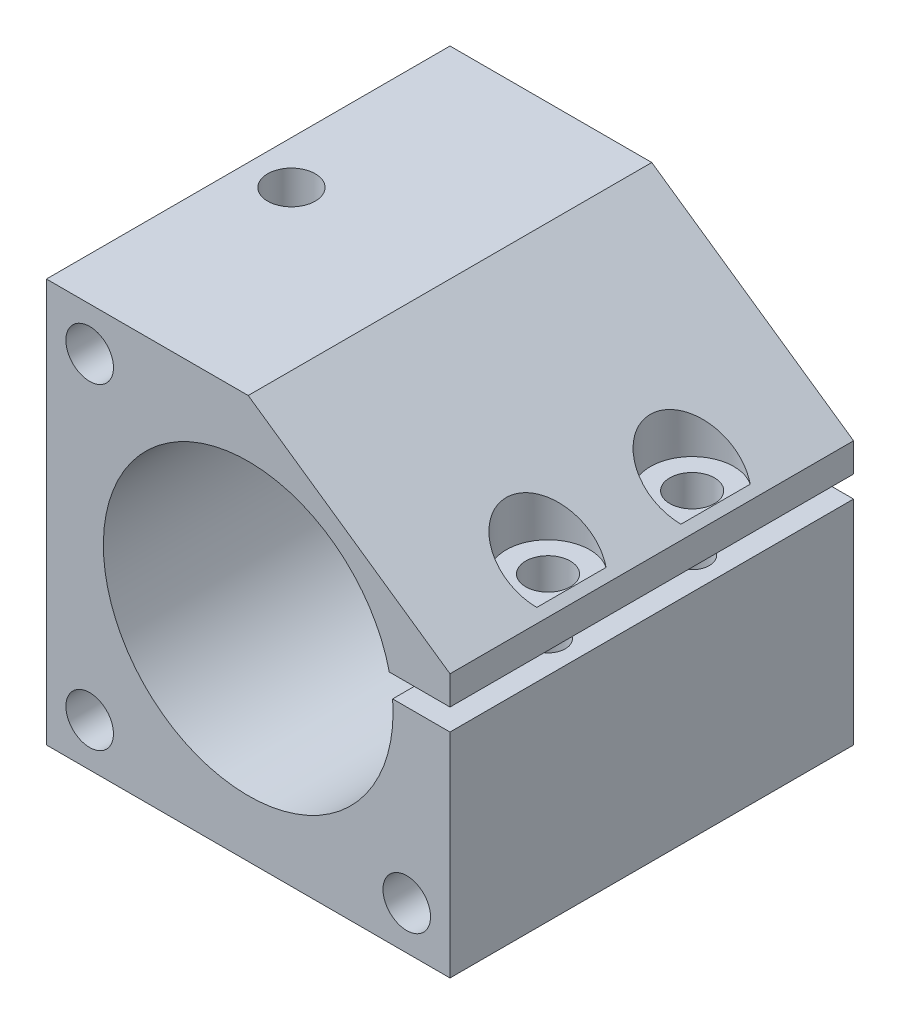
ISO-10303-21;
HEADER;
FILE_DESCRIPTION(('STEP AP214'),'2;1');
FILE_NAME('part.step','',(''),(''),'','','');
FILE_SCHEMA(('AUTOMOTIVE_DESIGN { 1 0 10303 214 1 1 1 1 }'));
ENDSEC;
DATA;
#1=APPLICATION_CONTEXT('core data for automotive mechanical design processes');
#2=APPLICATION_PROTOCOL_DEFINITION('international standard','automotive_design',2000,#1);
#3=PRODUCT_CONTEXT('',#1,'mechanical');
#4=PRODUCT('Part','Part','',(#3));
#5=PRODUCT_RELATED_PRODUCT_CATEGORY('part','',(#4));
#6=PRODUCT_DEFINITION_FORMATION('','',#4);
#7=PRODUCT_DEFINITION_CONTEXT('part definition',#1,'design');
#8=PRODUCT_DEFINITION('design','',#6,#7);
#9=PRODUCT_DEFINITION_SHAPE('','',#8);
#10=(LENGTH_UNIT() NAMED_UNIT(*) SI_UNIT(.MILLI.,.METRE.));
#11=(NAMED_UNIT(*) PLANE_ANGLE_UNIT() SI_UNIT($,.RADIAN.));
#12=(NAMED_UNIT(*) SI_UNIT($,.STERADIAN.) SOLID_ANGLE_UNIT());
#13=UNCERTAINTY_MEASURE_WITH_UNIT(LENGTH_MEASURE(1.E-05),#10,'distance_accuracy_value','');
#14=(GEOMETRIC_REPRESENTATION_CONTEXT(3) GLOBAL_UNCERTAINTY_ASSIGNED_CONTEXT((#13)) GLOBAL_UNIT_ASSIGNED_CONTEXT((#10,
#11,#12)) REPRESENTATION_CONTEXT('',''));
#15=CARTESIAN_POINT('',(0.,0.,0.));
#16=DIRECTION('',(0.,0.,1.));
#17=DIRECTION('',(1.,0.,0.));
#18=AXIS2_PLACEMENT_3D('',#15,#16,#17);
#19=CARTESIAN_POINT('',(11.,-11.,28.));
#20=DIRECTION('',(0.,0.,-1.));
#21=DIRECTION('',(-1.,0.,0.));
#22=AXIS2_PLACEMENT_3D('',#19,#20,#21);
#23=CYLINDRICAL_SURFACE('',#22,1.65);
#24=CARTESIAN_POINT('',(11.,-11.,0.));
#25=DIRECTION('',(0.,0.,1.));
#26=DIRECTION('',(1.,0.,0.));
#27=AXIS2_PLACEMENT_3D('',#24,#25,#26);
#28=CIRCLE('',#27,1.65);
#29=CARTESIAN_POINT('',(12.65,-11.,0.));
#30=VERTEX_POINT('',#29);
#31=EDGE_CURVE('E174',#30,#30,#28,.T.);
#32=ORIENTED_EDGE('',*,*,#31,.F.);
#33=EDGE_LOOP('',(#32));
#34=FACE_BOUND('',#33,.T.);
#35=CARTESIAN_POINT('',(11.,-11.,11.));
#36=DIRECTION('',(0.,0.,1.));
#37=DIRECTION('',(1.,0.,0.));
#38=AXIS2_PLACEMENT_3D('',#35,#36,#37);
#39=CIRCLE('',#38,1.65);
#40=CARTESIAN_POINT('',(12.65,-11.,11.));
#41=VERTEX_POINT('',#40);
#42=EDGE_CURVE('E343',#41,#41,#39,.T.);
#43=ORIENTED_EDGE('',*,*,#42,.T.);
#44=EDGE_LOOP('',(#43));
#45=FACE_BOUND('',#44,.T.);
#46=ADVANCED_FACE('F35',(#34,#45),#23,.F.);
#47=CARTESIAN_POINT('',(-11.,-11.,28.));
#48=DIRECTION('',(0.,0.,-1.));
#49=DIRECTION('',(-1.,0.,0.));
#50=AXIS2_PLACEMENT_3D('',#47,#48,#49);
#51=CYLINDRICAL_SURFACE('',#50,1.65000000000001);
#52=CARTESIAN_POINT('',(-11.,-11.,0.));
#53=DIRECTION('',(0.,0.,1.));
#54=DIRECTION('',(-1.,0.,0.));
#55=AXIS2_PLACEMENT_3D('',#52,#53,#54);
#56=CIRCLE('',#55,1.65000000000001);
#57=CARTESIAN_POINT('',(-12.65,-11.,0.));
#58=VERTEX_POINT('',#57);
#59=EDGE_CURVE('E165',#58,#58,#56,.T.);
#60=ORIENTED_EDGE('',*,*,#59,.F.);
#61=EDGE_LOOP('',(#60));
#62=FACE_BOUND('',#61,.T.);
#63=CARTESIAN_POINT('',(-11.,-11.,11.));
#64=DIRECTION('',(0.,0.,1.));
#65=DIRECTION('',(1.,0.,0.));
#66=AXIS2_PLACEMENT_3D('',#63,#64,#65);
#67=CIRCLE('',#66,1.65000000000001);
#68=CARTESIAN_POINT('',(-9.34999999999999,-11.,11.));
#69=VERTEX_POINT('',#68);
#70=EDGE_CURVE('E340',#69,#69,#67,.T.);
#71=ORIENTED_EDGE('',*,*,#70,.T.);
#72=EDGE_LOOP('',(#71));
#73=FACE_BOUND('',#72,.T.);
#74=ADVANCED_FACE('F159',(#62,#73),#51,.F.);
#75=CARTESIAN_POINT('',(-11.,11.,28.));
#76=DIRECTION('',(0.,0.,-1.));
#77=DIRECTION('',(-1.,0.,0.));
#78=AXIS2_PLACEMENT_3D('',#75,#76,#77);
#79=CYLINDRICAL_SURFACE('',#78,1.65000000000001);
#80=CARTESIAN_POINT('',(-11.,11.,0.));
#81=DIRECTION('',(0.,0.,1.));
#82=DIRECTION('',(1.,0.,0.));
#83=AXIS2_PLACEMENT_3D('',#80,#81,#82);
#84=CIRCLE('',#83,1.65000000000001);
#85=CARTESIAN_POINT('',(-9.34999999999999,11.,0.));
#86=VERTEX_POINT('',#85);
#87=EDGE_CURVE('E164',#86,#86,#84,.T.);
#88=ORIENTED_EDGE('',*,*,#87,.F.);
#89=EDGE_LOOP('',(#88));
#90=FACE_BOUND('',#89,.T.);
#91=CARTESIAN_POINT('',(-11.,11.,11.));
#92=DIRECTION('',(0.,0.,1.));
#93=DIRECTION('',(1.,0.,0.));
#94=AXIS2_PLACEMENT_3D('',#91,#92,#93);
#95=CIRCLE('',#94,1.65000000000001);
#96=CARTESIAN_POINT('',(-9.34999999999999,11.,11.));
#97=VERTEX_POINT('',#96);
#98=EDGE_CURVE('E335',#97,#97,#95,.T.);
#99=ORIENTED_EDGE('',*,*,#98,.T.);
#100=EDGE_LOOP('',(#99));
#101=FACE_BOUND('',#100,.T.);
#102=ADVANCED_FACE('F304',(#90,#101),#79,.F.);
#103=CARTESIAN_POINT('',(0.,0.,28.));
#104=DIRECTION('',(0.,0.,1.));
#105=DIRECTION('',(1.,0.,0.));
#106=AXIS2_PLACEMENT_3D('',#103,#104,#105);
#107=PLANE('',#106);
#108=CARTESIAN_POINT('',(-11.,-11.,28.));
#109=DIRECTION('',(0.,0.,1.));
#110=DIRECTION('',(-1.,0.,0.));
#111=AXIS2_PLACEMENT_3D('',#108,#109,#110);
#112=CIRCLE('',#111,1.65000000000001);
#113=CARTESIAN_POINT('',(-12.65,-11.,28.));
#114=VERTEX_POINT('',#113);
#115=EDGE_CURVE('E162',#114,#114,#112,.T.);
#116=ORIENTED_EDGE('',*,*,#115,.F.);
#117=EDGE_LOOP('',(#116));
#118=FACE_BOUND('',#117,.T.);
#119=DIRECTION('',(-1.,0.,0.));
#120=VECTOR('',#119,1.);
#121=CARTESIAN_POINT('',(-14.,14.,28.));
#122=LINE('',#121,#120);
#123=CARTESIAN_POINT('',(0.,14.,28.));
#124=VERTEX_POINT('',#123);
#125=CARTESIAN_POINT('',(-14.,14.,28.));
#126=VERTEX_POINT('',#125);
#127=EDGE_CURVE('E180',#124,#126,#122,.T.);
#128=ORIENTED_EDGE('',*,*,#127,.T.);
#129=DIRECTION('',(0.,-1.,0.));
#130=VECTOR('',#129,1.);
#131=CARTESIAN_POINT('',(-14.,-14.,28.));
#132=LINE('',#131,#130);
#133=CARTESIAN_POINT('',(-14.,-14.,28.));
#134=VERTEX_POINT('',#133);
#135=EDGE_CURVE('E183',#126,#134,#132,.T.);
#136=ORIENTED_EDGE('',*,*,#135,.T.);
#137=DIRECTION('',(1.,0.,0.));
#138=VECTOR('',#137,1.);
#139=CARTESIAN_POINT('',(-14.,-14.,28.));
#140=LINE('',#139,#138);
#141=CARTESIAN_POINT('',(14.,-14.,28.));
#142=VERTEX_POINT('',#141);
#143=EDGE_CURVE('E186',#134,#142,#140,.T.);
#144=ORIENTED_EDGE('',*,*,#143,.T.);
#145=DIRECTION('',(0.,1.,0.));
#146=VECTOR('',#145,1.);
#147=CARTESIAN_POINT('',(14.,0.779909916634857,28.));
#148=LINE('',#147,#146);
#149=CARTESIAN_POINT('',(14.,0.779909916634857,28.));
#150=VERTEX_POINT('',#149);
#151=EDGE_CURVE('E188',#142,#150,#148,.T.);
#152=ORIENTED_EDGE('',*,*,#151,.T.);
#153=DIRECTION('',(-1.,0.,0.));
#154=VECTOR('',#153,1.);
#155=CARTESIAN_POINT('',(14.,0.779909916634857,28.));
#156=LINE('',#155,#154);
#157=CARTESIAN_POINT('',(10.0196926361009,0.779909916634855,28.));
#158=VERTEX_POINT('',#157);
#159=EDGE_CURVE('E190',#150,#158,#156,.T.);
#160=ORIENTED_EDGE('',*,*,#159,.T.);
#161=CARTESIAN_POINT('',(0.,0.,28.));
#162=DIRECTION('',(0.,0.,-1.));
#163=DIRECTION('',(1.,0.,0.));
#164=AXIS2_PLACEMENT_3D('',#161,#162,#163);
#165=CIRCLE('',#164,10.05);
#166=CARTESIAN_POINT('',(9.78797786940848,2.27990991663485,28.));
#167=VERTEX_POINT('',#166);
#168=EDGE_CURVE('E192',#158,#167,#165,.T.);
#169=ORIENTED_EDGE('',*,*,#168,.T.);
#170=DIRECTION('',(1.,0.,0.));
#171=VECTOR('',#170,1.);
#172=CARTESIAN_POINT('',(14.,2.27990991663486,28.));
#173=LINE('',#172,#171);
#174=CARTESIAN_POINT('',(14.,2.27990991663486,28.));
#175=VERTEX_POINT('',#174);
#176=EDGE_CURVE('E194',#167,#175,#173,.T.);
#177=ORIENTED_EDGE('',*,*,#176,.T.);
#178=DIRECTION('',(0.,1.,0.));
#179=VECTOR('',#178,1.);
#180=CARTESIAN_POINT('',(14.,4.27990991663486,28.));
#181=LINE('',#180,#179);
#182=CARTESIAN_POINT('',(14.,4.27990991663486,28.));
#183=VERTEX_POINT('',#182);
#184=EDGE_CURVE('E196',#175,#183,#181,.T.);
#185=ORIENTED_EDGE('',*,*,#184,.T.);
#186=DIRECTION('',(-0.821428571428571,0.570311407952547,0.));
#187=VECTOR('',#186,1.);
#188=CARTESIAN_POINT('',(0.,14.,28.));
#189=LINE('',#188,#187);
#190=EDGE_CURVE('E198',#183,#124,#189,.T.);
#191=ORIENTED_EDGE('',*,*,#190,.T.);
#192=EDGE_LOOP('',(#128,#136,#144,#152,#160,#169,#177,#185,#191));
#193=FACE_BOUND('',#192,.T.);
#194=CARTESIAN_POINT('',(-11.,11.,28.));
#195=DIRECTION('',(0.,0.,1.));
#196=DIRECTION('',(1.,0.,0.));
#197=AXIS2_PLACEMENT_3D('',#194,#195,#196);
#198=CIRCLE('',#197,1.65000000000001);
#199=CARTESIAN_POINT('',(-9.34999999999999,11.,28.));
#200=VERTEX_POINT('',#199);
#201=EDGE_CURVE('E168',#200,#200,#198,.T.);
#202=ORIENTED_EDGE('',*,*,#201,.F.);
#203=EDGE_LOOP('',(#202));
#204=FACE_BOUND('',#203,.T.);
#205=CARTESIAN_POINT('',(11.,-11.,28.));
#206=DIRECTION('',(0.,0.,1.));
#207=DIRECTION('',(1.,0.,0.));
#208=AXIS2_PLACEMENT_3D('',#205,#206,#207);
#209=CIRCLE('',#208,1.65);
#210=CARTESIAN_POINT('',(12.65,-11.,28.));
#211=VERTEX_POINT('',#210);
#212=EDGE_CURVE('E171',#211,#211,#209,.T.);
#213=ORIENTED_EDGE('',*,*,#212,.F.);
#214=EDGE_LOOP('',(#213));
#215=FACE_BOUND('',#214,.T.);
#216=ADVANCED_FACE('F267',(#118,#193,#204,#215),#107,.T.);
#217=CARTESIAN_POINT('',(0.,0.,0.));
#218=DIRECTION('',(0.,0.,1.));
#219=DIRECTION('',(1.,0.,0.));
#220=AXIS2_PLACEMENT_3D('',#217,#218,#219);
#221=PLANE('',#220);
#222=DIRECTION('',(-1.,0.,0.));
#223=VECTOR('',#222,1.);
#224=CARTESIAN_POINT('',(-14.,14.,0.));
#225=LINE('',#224,#223);
#226=CARTESIAN_POINT('',(0.,14.,0.));
#227=VERTEX_POINT('',#226);
#228=CARTESIAN_POINT('',(-14.,14.,0.));
#229=VERTEX_POINT('',#228);
#230=EDGE_CURVE('E178',#227,#229,#225,.T.);
#231=ORIENTED_EDGE('',*,*,#230,.F.);
#232=DIRECTION('',(-0.821428571428571,0.570311407952547,0.));
#233=VECTOR('',#232,1.);
#234=CARTESIAN_POINT('',(0.,14.,0.));
#235=LINE('',#234,#233);
#236=CARTESIAN_POINT('',(14.,4.27990991663486,0.));
#237=VERTEX_POINT('',#236);
#238=EDGE_CURVE('E184',#237,#227,#235,.T.);
#239=ORIENTED_EDGE('',*,*,#238,.F.);
#240=DIRECTION('',(0.,1.,0.));
#241=VECTOR('',#240,1.);
#242=CARTESIAN_POINT('',(14.,4.27990991663486,0.));
#243=LINE('',#242,#241);
#244=CARTESIAN_POINT('',(14.,2.27990991663486,0.));
#245=VERTEX_POINT('',#244);
#246=EDGE_CURVE('E215',#245,#237,#243,.T.);
#247=ORIENTED_EDGE('',*,*,#246,.F.);
#248=DIRECTION('',(1.,0.,0.));
#249=VECTOR('',#248,1.);
#250=CARTESIAN_POINT('',(14.,2.27990991663486,0.));
#251=LINE('',#250,#249);
#252=CARTESIAN_POINT('',(9.78797786940848,2.27990991663485,0.));
#253=VERTEX_POINT('',#252);
#254=EDGE_CURVE('E213',#253,#245,#251,.T.);
#255=ORIENTED_EDGE('',*,*,#254,.F.);
#256=CARTESIAN_POINT('',(0.,0.,0.));
#257=DIRECTION('',(0.,0.,-1.));
#258=DIRECTION('',(1.,0.,0.));
#259=AXIS2_PLACEMENT_3D('',#256,#257,#258);
#260=CIRCLE('',#259,10.05);
#261=CARTESIAN_POINT('',(10.0196926361009,0.779909916634855,0.));
#262=VERTEX_POINT('',#261);
#263=EDGE_CURVE('E211',#262,#253,#260,.T.);
#264=ORIENTED_EDGE('',*,*,#263,.F.);
#265=DIRECTION('',(-1.,0.,0.));
#266=VECTOR('',#265,1.);
#267=CARTESIAN_POINT('',(14.,0.779909916634857,0.));
#268=LINE('',#267,#266);
#269=CARTESIAN_POINT('',(14.,0.779909916634857,0.));
#270=VERTEX_POINT('',#269);
#271=EDGE_CURVE('E209',#270,#262,#268,.T.);
#272=ORIENTED_EDGE('',*,*,#271,.F.);
#273=DIRECTION('',(0.,1.,0.));
#274=VECTOR('',#273,1.);
#275=CARTESIAN_POINT('',(14.,0.779909916634857,0.));
#276=LINE('',#275,#274);
#277=CARTESIAN_POINT('',(14.,-14.,0.));
#278=VERTEX_POINT('',#277);
#279=EDGE_CURVE('E207',#278,#270,#276,.T.);
#280=ORIENTED_EDGE('',*,*,#279,.F.);
#281=DIRECTION('',(1.,0.,0.));
#282=VECTOR('',#281,1.);
#283=CARTESIAN_POINT('',(-14.,-14.,0.));
#284=LINE('',#283,#282);
#285=CARTESIAN_POINT('',(-14.,-14.,0.));
#286=VERTEX_POINT('',#285);
#287=EDGE_CURVE('E205',#286,#278,#284,.T.);
#288=ORIENTED_EDGE('',*,*,#287,.F.);
#289=DIRECTION('',(0.,-1.,0.));
#290=VECTOR('',#289,1.);
#291=CARTESIAN_POINT('',(-14.,-14.,0.));
#292=LINE('',#291,#290);
#293=EDGE_CURVE('E203',#229,#286,#292,.T.);
#294=ORIENTED_EDGE('',*,*,#293,.F.);
#295=EDGE_LOOP('',(#231,#239,#247,#255,#264,#272,#280,#288,#294));
#296=FACE_BOUND('',#295,.T.);
#297=ORIENTED_EDGE('',*,*,#87,.T.);
#298=EDGE_LOOP('',(#297));
#299=FACE_BOUND('',#298,.T.);
#300=ORIENTED_EDGE('',*,*,#59,.T.);
#301=EDGE_LOOP('',(#300));
#302=FACE_BOUND('',#301,.T.);
#303=ORIENTED_EDGE('',*,*,#31,.T.);
#304=EDGE_LOOP('',(#303));
#305=FACE_BOUND('',#304,.T.);
#306=ADVANCED_FACE('F251',(#296,#299,#302,#305),#221,.F.);
#307=CARTESIAN_POINT('',(-14.,14.,28.));
#308=DIRECTION('',(0.,-1.,0.));
#309=DIRECTION('',(0.,0.,-1.));
#310=AXIS2_PLACEMENT_3D('',#307,#308,#309);
#311=PLANE('',#310);
#312=CARTESIAN_POINT('',(-11.,14.,14.));
#313=DIRECTION('',(0.,1.,0.));
#314=DIRECTION('',(0.,0.,1.));
#315=AXIS2_PLACEMENT_3D('',#312,#313,#314);
#316=CIRCLE('',#315,1.65);
#317=CARTESIAN_POINT('',(-11.,14.,15.65));
#318=VERTEX_POINT('',#317);
#319=EDGE_CURVE('E359',#318,#318,#316,.T.);
#320=ORIENTED_EDGE('',*,*,#319,.F.);
#321=EDGE_LOOP('',(#320));
#322=FACE_BOUND('',#321,.T.);
#323=ORIENTED_EDGE('',*,*,#230,.T.);
#324=DIRECTION('',(0.,0.,-1.));
#325=VECTOR('',#324,1.);
#326=CARTESIAN_POINT('',(-14.,14.,28.));
#327=LINE('',#326,#325);
#328=EDGE_CURVE('E121',#126,#229,#327,.T.);
#329=ORIENTED_EDGE('',*,*,#328,.F.);
#330=ORIENTED_EDGE('',*,*,#127,.F.);
#331=DIRECTION('',(0.,0.,-1.));
#332=VECTOR('',#331,1.);
#333=CARTESIAN_POINT('',(0.,14.,28.));
#334=LINE('',#333,#332);
#335=EDGE_CURVE('E200',#124,#227,#334,.T.);
#336=ORIENTED_EDGE('',*,*,#335,.T.);
#337=EDGE_LOOP('',(#323,#329,#330,#336));
#338=FACE_BOUND('',#337,.T.);
#339=ADVANCED_FACE('F37',(#322,#338),#311,.F.);
#340=CARTESIAN_POINT('',(-14.,-14.,28.));
#341=DIRECTION('',(1.,0.,0.));
#342=DIRECTION('',(0.,0.,-1.));
#343=AXIS2_PLACEMENT_3D('',#340,#341,#342);
#344=PLANE('',#343);
#345=ORIENTED_EDGE('',*,*,#293,.T.);
#346=DIRECTION('',(0.,0.,-1.));
#347=VECTOR('',#346,1.);
#348=CARTESIAN_POINT('',(-14.,-14.,28.));
#349=LINE('',#348,#347);
#350=EDGE_CURVE('E238',#134,#286,#349,.T.);
#351=ORIENTED_EDGE('',*,*,#350,.F.);
#352=ORIENTED_EDGE('',*,*,#135,.F.);
#353=ORIENTED_EDGE('',*,*,#328,.T.);
#354=EDGE_LOOP('',(#345,#351,#352,#353));
#355=FACE_BOUND('',#354,.T.);
#356=ADVANCED_FACE('F243',(#355),#344,.F.);
#357=CARTESIAN_POINT('',(-14.,-14.,28.));
#358=DIRECTION('',(0.,1.,0.));
#359=DIRECTION('',(0.,0.,1.));
#360=AXIS2_PLACEMENT_3D('',#357,#358,#359);
#361=PLANE('',#360);
#362=CARTESIAN_POINT('',(-11.,-14.,14.));
#363=DIRECTION('',(0.,1.,0.));
#364=DIRECTION('',(0.,0.,1.));
#365=AXIS2_PLACEMENT_3D('',#362,#363,#364);
#366=CIRCLE('',#365,1.65);
#367=CARTESIAN_POINT('',(-11.,-14.,15.65));
#368=VERTEX_POINT('',#367);
#369=EDGE_CURVE('E354',#368,#368,#366,.T.);
#370=ORIENTED_EDGE('',*,*,#369,.T.);
#371=EDGE_LOOP('',(#370));
#372=FACE_BOUND('',#371,.T.);
#373=CARTESIAN_POINT('',(11.,-14.,14.));
#374=DIRECTION('',(0.,1.,0.));
#375=DIRECTION('',(0.,0.,-1.));
#376=AXIS2_PLACEMENT_3D('',#373,#374,#375);
#377=CIRCLE('',#376,1.65);
#378=CARTESIAN_POINT('',(11.,-14.,12.35));
#379=VERTEX_POINT('',#378);
#380=EDGE_CURVE('E347',#379,#379,#377,.T.);
#381=ORIENTED_EDGE('',*,*,#380,.T.);
#382=EDGE_LOOP('',(#381));
#383=FACE_BOUND('',#382,.T.);
#384=ORIENTED_EDGE('',*,*,#287,.T.);
#385=DIRECTION('',(0.,0.,-1.));
#386=VECTOR('',#385,1.);
#387=CARTESIAN_POINT('',(14.,-14.,28.));
#388=LINE('',#387,#386);
#389=EDGE_CURVE('E235',#142,#278,#388,.T.);
#390=ORIENTED_EDGE('',*,*,#389,.F.);
#391=ORIENTED_EDGE('',*,*,#143,.F.);
#392=ORIENTED_EDGE('',*,*,#350,.T.);
#393=EDGE_LOOP('',(#384,#390,#391,#392));
#394=FACE_BOUND('',#393,.T.);
#395=ADVANCED_FACE('F259',(#372,#383,#394),#361,.F.);
#396=CARTESIAN_POINT('',(14.,0.779909916634857,28.));
#397=DIRECTION('',(-1.,0.,0.));
#398=DIRECTION('',(0.,-1.,0.));
#399=AXIS2_PLACEMENT_3D('',#396,#397,#398);
#400=PLANE('',#399);
#401=ORIENTED_EDGE('',*,*,#279,.T.);
#402=DIRECTION('',(0.,0.,-1.));
#403=VECTOR('',#402,1.);
#404=CARTESIAN_POINT('',(14.,0.779909916634857,28.));
#405=LINE('',#404,#403);
#406=EDGE_CURVE('E232',#150,#270,#405,.T.);
#407=ORIENTED_EDGE('',*,*,#406,.F.);
#408=ORIENTED_EDGE('',*,*,#151,.F.);
#409=ORIENTED_EDGE('',*,*,#389,.T.);
#410=EDGE_LOOP('',(#401,#407,#408,#409));
#411=FACE_BOUND('',#410,.T.);
#412=ADVANCED_FACE('F263',(#411),#400,.F.);
#413=CARTESIAN_POINT('',(14.,0.779909916634857,28.));
#414=DIRECTION('',(0.,-1.,0.));
#415=DIRECTION('',(1.,0.,0.));
#416=AXIS2_PLACEMENT_3D('',#413,#414,#415);
#417=PLANE('',#416);
#418=CARTESIAN_POINT('',(11.8,0.779909916634855,9.));
#419=DIRECTION('',(0.,-1.,0.));
#420=DIRECTION('',(1.,0.,0.));
#421=AXIS2_PLACEMENT_3D('',#418,#419,#420);
#422=CIRCLE('',#421,1.2);
#423=CARTESIAN_POINT('',(13.,0.779909916634857,9.));
#424=VERTEX_POINT('',#423);
#425=EDGE_CURVE('E142',#424,#424,#422,.F.);
#426=ORIENTED_EDGE('',*,*,#425,.F.);
#427=EDGE_LOOP('',(#426));
#428=FACE_BOUND('',#427,.T.);
#429=CARTESIAN_POINT('',(11.8,0.779909916634855,19.));
#430=DIRECTION('',(0.,-1.,0.));
#431=DIRECTION('',(1.,0.,0.));
#432=AXIS2_PLACEMENT_3D('',#429,#430,#431);
#433=CIRCLE('',#432,1.2);
#434=CARTESIAN_POINT('',(13.,0.779909916634857,19.));
#435=VERTEX_POINT('',#434);
#436=EDGE_CURVE('E139',#435,#435,#433,.F.);
#437=ORIENTED_EDGE('',*,*,#436,.F.);
#438=EDGE_LOOP('',(#437));
#439=FACE_BOUND('',#438,.T.);
#440=ORIENTED_EDGE('',*,*,#271,.T.);
#441=DIRECTION('',(0.,0.,-1.));
#442=VECTOR('',#441,1.);
#443=CARTESIAN_POINT('',(10.0196926361009,0.779909916634855,28.));
#444=LINE('',#443,#442);
#445=EDGE_CURVE('E229',#158,#262,#444,.T.);
#446=ORIENTED_EDGE('',*,*,#445,.F.);
#447=ORIENTED_EDGE('',*,*,#159,.F.);
#448=ORIENTED_EDGE('',*,*,#406,.T.);
#449=EDGE_LOOP('',(#440,#446,#447,#448));
#450=FACE_BOUND('',#449,.T.);
#451=ADVANCED_FACE('F286',(#428,#439,#450),#417,.F.);
#452=CARTESIAN_POINT('',(0.,0.,28.));
#453=DIRECTION('',(0.,0.,-1.));
#454=DIRECTION('',(-1.,0.,0.));
#455=AXIS2_PLACEMENT_3D('',#452,#453,#454);
#456=CYLINDRICAL_SURFACE('',#455,10.05);
#457=ORIENTED_EDGE('',*,*,#263,.T.);
#458=DIRECTION('',(0.,0.,-1.));
#459=VECTOR('',#458,1.);
#460=CARTESIAN_POINT('',(9.78797786940848,2.27990991663485,28.));
#461=LINE('',#460,#459);
#462=EDGE_CURVE('E226',#167,#253,#461,.T.);
#463=ORIENTED_EDGE('',*,*,#462,.F.);
#464=ORIENTED_EDGE('',*,*,#168,.F.);
#465=ORIENTED_EDGE('',*,*,#445,.T.);
#466=EDGE_LOOP('',(#457,#463,#464,#465));
#467=FACE_BOUND('',#466,.T.);
#468=ADVANCED_FACE('F284',(#467),#456,.F.);
#469=CARTESIAN_POINT('',(14.,2.27990991663486,28.));
#470=DIRECTION('',(0.,1.,0.));
#471=DIRECTION('',(-1.,0.,0.));
#472=AXIS2_PLACEMENT_3D('',#469,#470,#471);
#473=PLANE('',#472);
#474=CARTESIAN_POINT('',(11.8,2.27990991663485,9.));
#475=DIRECTION('',(0.,1.,0.));
#476=DIRECTION('',(-1.,0.,0.));
#477=AXIS2_PLACEMENT_3D('',#474,#475,#476);
#478=CIRCLE('',#477,1.55);
#479=CARTESIAN_POINT('',(10.25,2.27990991663485,9.));
#480=VERTEX_POINT('',#479);
#481=EDGE_CURVE('E324',#480,#480,#478,.T.);
#482=ORIENTED_EDGE('',*,*,#481,.T.);
#483=EDGE_LOOP('',(#482));
#484=FACE_BOUND('',#483,.T.);
#485=CARTESIAN_POINT('',(11.8,2.27990991663485,19.));
#486=DIRECTION('',(0.,1.,0.));
#487=DIRECTION('',(-1.,0.,0.));
#488=AXIS2_PLACEMENT_3D('',#485,#486,#487);
#489=CIRCLE('',#488,1.55);
#490=CARTESIAN_POINT('',(10.25,2.27990991663485,19.));
#491=VERTEX_POINT('',#490);
#492=EDGE_CURVE('E125',#491,#491,#489,.T.);
#493=ORIENTED_EDGE('',*,*,#492,.T.);
#494=EDGE_LOOP('',(#493));
#495=FACE_BOUND('',#494,.T.);
#496=ORIENTED_EDGE('',*,*,#254,.T.);
#497=DIRECTION('',(0.,0.,-1.));
#498=VECTOR('',#497,1.);
#499=CARTESIAN_POINT('',(14.,2.27990991663486,28.));
#500=LINE('',#499,#498);
#501=EDGE_CURVE('E223',#175,#245,#500,.T.);
#502=ORIENTED_EDGE('',*,*,#501,.F.);
#503=ORIENTED_EDGE('',*,*,#176,.F.);
#504=ORIENTED_EDGE('',*,*,#462,.T.);
#505=EDGE_LOOP('',(#496,#502,#503,#504));
#506=FACE_BOUND('',#505,.T.);
#507=ADVANCED_FACE('F279',(#484,#495,#506),#473,.F.);
#508=CARTESIAN_POINT('',(14.,4.27990991663486,28.));
#509=DIRECTION('',(-1.,0.,0.));
#510=DIRECTION('',(0.,-1.,0.));
#511=AXIS2_PLACEMENT_3D('',#508,#509,#510);
#512=PLANE('',#511);
#513=ORIENTED_EDGE('',*,*,#246,.T.);
#514=DIRECTION('',(0.,0.,-1.));
#515=VECTOR('',#514,1.);
#516=CARTESIAN_POINT('',(14.,4.27990991663486,28.));
#517=LINE('',#516,#515);
#518=EDGE_CURVE('E220',#183,#237,#517,.T.);
#519=ORIENTED_EDGE('',*,*,#518,.F.);
#520=ORIENTED_EDGE('',*,*,#184,.F.);
#521=ORIENTED_EDGE('',*,*,#501,.T.);
#522=EDGE_LOOP('',(#513,#519,#520,#521));
#523=FACE_BOUND('',#522,.T.);
#524=ADVANCED_FACE('F274',(#523),#512,.F.);
#525=CARTESIAN_POINT('',(0.,14.,28.));
#526=DIRECTION('',(-0.570311407952547,-0.821428571428571,0.));
#527=DIRECTION('',(0.821428571428572,-0.570311407952547,0.));
#528=AXIS2_PLACEMENT_3D('',#525,#526,#527);
#529=PLANE('',#528);
#530=DIRECTION('',(0.,0.,1.));
#531=VECTOR('',#530,1.);
#532=CARTESIAN_POINT('',(13.4238736522017,4.67990991663484,28.));
#533=LINE('',#532,#531);
#534=CARTESIAN_POINT('',(13.4238736522017,4.67990991663484,6.59728604247506));
#535=VERTEX_POINT('',#534);
#536=CARTESIAN_POINT('',(13.4238736522017,4.67990991663484,11.4027139575249));
#537=VERTEX_POINT('',#536);
#538=EDGE_CURVE('E129',#535,#537,#533,.T.);
#539=ORIENTED_EDGE('',*,*,#538,.T.);
#540=CARTESIAN_POINT('',(11.8,5.80735264402081,9.));
#541=DIRECTION('',(-0.570311407952547,-0.821428571428571,0.));
#542=DIRECTION('',(0.821428571428572,-0.570311407952547,0.));
#543=AXIS2_PLACEMENT_3D('',#540,#541,#542);
#544=ELLIPSE('',#543,3.5304347826087,2.9);
#545=EDGE_CURVE('E132',#537,#535,#544,.T.);
#546=ORIENTED_EDGE('',*,*,#545,.T.);
#547=EDGE_LOOP('',(#539,#546));
#548=FACE_BOUND('',#547,.T.);
#549=DIRECTION('',(0.,0.,1.));
#550=VECTOR('',#549,1.);
#551=CARTESIAN_POINT('',(13.4238736522017,4.67990991663484,28.));
#552=LINE('',#551,#550);
#553=CARTESIAN_POINT('',(13.4238736522017,4.67990991663484,16.5972860424751));
#554=VERTEX_POINT('',#553);
#555=CARTESIAN_POINT('',(13.4238736522017,4.67990991663484,21.4027139575249));
#556=VERTEX_POINT('',#555);
#557=EDGE_CURVE('E116',#554,#556,#552,.T.);
#558=ORIENTED_EDGE('',*,*,#557,.T.);
#559=CARTESIAN_POINT('',(11.8,5.80735264402081,19.));
#560=DIRECTION('',(-0.570311407952547,-0.821428571428571,0.));
#561=DIRECTION('',(0.821428571428572,-0.570311407952547,0.));
#562=AXIS2_PLACEMENT_3D('',#559,#560,#561);
#563=ELLIPSE('',#562,3.5304347826087,2.9);
#564=EDGE_CURVE('E120',#556,#554,#563,.T.);
#565=ORIENTED_EDGE('',*,*,#564,.T.);
#566=EDGE_LOOP('',(#558,#565));
#567=FACE_BOUND('',#566,.T.);
#568=ORIENTED_EDGE('',*,*,#238,.T.);
#569=ORIENTED_EDGE('',*,*,#335,.F.);
#570=ORIENTED_EDGE('',*,*,#190,.F.);
#571=ORIENTED_EDGE('',*,*,#518,.T.);
#572=EDGE_LOOP('',(#568,#569,#570,#571));
#573=FACE_BOUND('',#572,.T.);
#574=ADVANCED_FACE('F127',(#548,#567,#573),#529,.F.);
#575=CARTESIAN_POINT('',(-11.,11.,17.));
#576=DIRECTION('',(0.,0.,1.));
#577=DIRECTION('',(1.,0.,0.));
#578=AXIS2_PLACEMENT_3D('',#575,#576,#577);
#579=CIRCLE('',#578,1.65000000000001);
#580=CARTESIAN_POINT('',(-9.34999999999999,11.,17.));
#581=VERTEX_POINT('',#580);
#582=EDGE_CURVE('E138',#581,#581,#579,.T.);
#583=ORIENTED_EDGE('',*,*,#582,.F.);
#584=EDGE_LOOP('',(#583));
#585=FACE_BOUND('',#584,.T.);
#586=ORIENTED_EDGE('',*,*,#201,.T.);
#587=EDGE_LOOP('',(#586));
#588=FACE_BOUND('',#587,.T.);
#589=ADVANCED_FACE('F157',(#585,#588),#79,.F.);
#590=CARTESIAN_POINT('',(-11.,-11.,17.));
#591=DIRECTION('',(0.,0.,1.));
#592=DIRECTION('',(1.,0.,0.));
#593=AXIS2_PLACEMENT_3D('',#590,#591,#592);
#594=CIRCLE('',#593,1.65000000000001);
#595=CARTESIAN_POINT('',(-9.34999999999999,-11.,17.));
#596=VERTEX_POINT('',#595);
#597=EDGE_CURVE('E43',#596,#596,#594,.T.);
#598=ORIENTED_EDGE('',*,*,#597,.F.);
#599=EDGE_LOOP('',(#598));
#600=FACE_BOUND('',#599,.T.);
#601=ORIENTED_EDGE('',*,*,#115,.T.);
#602=EDGE_LOOP('',(#601));
#603=FACE_BOUND('',#602,.T.);
#604=ADVANCED_FACE('F153',(#600,#603),#51,.F.);
#605=CARTESIAN_POINT('',(11.,-11.,17.));
#606=DIRECTION('',(0.,0.,1.));
#607=DIRECTION('',(1.,0.,0.));
#608=AXIS2_PLACEMENT_3D('',#605,#606,#607);
#609=CIRCLE('',#608,1.65);
#610=CARTESIAN_POINT('',(12.65,-11.,17.));
#611=VERTEX_POINT('',#610);
#612=EDGE_CURVE('E11',#611,#611,#609,.T.);
#613=ORIENTED_EDGE('',*,*,#612,.F.);
#614=EDGE_LOOP('',(#613));
#615=FACE_BOUND('',#614,.T.);
#616=ORIENTED_EDGE('',*,*,#212,.T.);
#617=EDGE_LOOP('',(#616));
#618=FACE_BOUND('',#617,.T.);
#619=ADVANCED_FACE('F156',(#615,#618),#23,.F.);
#620=CARTESIAN_POINT('',(11.8,14.,19.));
#621=DIRECTION('',(0.,-1.,0.));
#622=DIRECTION('',(0.,0.,-1.));
#623=AXIS2_PLACEMENT_3D('',#620,#621,#622);
#624=CYLINDRICAL_SURFACE('',#623,2.9);
#625=CARTESIAN_POINT('',(11.8,4.67990991663484,19.));
#626=DIRECTION('',(0.,-1.,0.));
#627=DIRECTION('',(0.,0.,-1.));
#628=AXIS2_PLACEMENT_3D('',#625,#626,#627);
#629=CIRCLE('',#628,2.9);
#630=EDGE_CURVE('E56',#556,#554,#629,.T.);
#631=ORIENTED_EDGE('',*,*,#630,.T.);
#632=ORIENTED_EDGE('',*,*,#564,.F.);
#633=EDGE_LOOP('',(#631,#632));
#634=FACE_BOUND('',#633,.T.);
#635=ADVANCED_FACE('F124',(#634),#624,.F.);
#636=CARTESIAN_POINT('',(11.8,4.67990991663484,19.));
#637=DIRECTION('',(0.,-1.,0.));
#638=DIRECTION('',(0.,0.,-1.));
#639=AXIS2_PLACEMENT_3D('',#636,#637,#638);
#640=PLANE('',#639);
#641=CARTESIAN_POINT('',(11.8,4.67990991663484,19.));
#642=DIRECTION('',(0.,1.,0.));
#643=DIRECTION('',(0.,0.,1.));
#644=AXIS2_PLACEMENT_3D('',#641,#642,#643);
#645=CIRCLE('',#644,1.55);
#646=CARTESIAN_POINT('',(11.8,4.67990991663484,20.55));
#647=VERTEX_POINT('',#646);
#648=EDGE_CURVE('E146',#647,#647,#645,.T.);
#649=ORIENTED_EDGE('',*,*,#648,.F.);
#650=EDGE_LOOP('',(#649));
#651=FACE_BOUND('',#650,.T.);
#652=ORIENTED_EDGE('',*,*,#630,.F.);
#653=ORIENTED_EDGE('',*,*,#557,.F.);
#654=EDGE_LOOP('',(#652,#653));
#655=FACE_BOUND('',#654,.T.);
#656=ADVANCED_FACE('F117',(#651,#655),#640,.F.);
#657=CARTESIAN_POINT('',(11.8,14.,9.));
#658=DIRECTION('',(0.,-1.,0.));
#659=DIRECTION('',(0.,0.,-1.));
#660=AXIS2_PLACEMENT_3D('',#657,#658,#659);
#661=CYLINDRICAL_SURFACE('',#660,2.9);
#662=CARTESIAN_POINT('',(11.8,4.67990991663484,9.));
#663=DIRECTION('',(0.,-1.,0.));
#664=DIRECTION('',(0.,0.,-1.));
#665=AXIS2_PLACEMENT_3D('',#662,#663,#664);
#666=CIRCLE('',#665,2.9);
#667=EDGE_CURVE('E49',#537,#535,#666,.T.);
#668=ORIENTED_EDGE('',*,*,#667,.T.);
#669=ORIENTED_EDGE('',*,*,#545,.F.);
#670=EDGE_LOOP('',(#668,#669));
#671=FACE_BOUND('',#670,.T.);
#672=ADVANCED_FACE('F418',(#671),#661,.F.);
#673=CARTESIAN_POINT('',(11.8,4.67990991663484,9.));
#674=DIRECTION('',(0.,-1.,0.));
#675=DIRECTION('',(0.,0.,-1.));
#676=AXIS2_PLACEMENT_3D('',#673,#674,#675);
#677=PLANE('',#676);
#678=CARTESIAN_POINT('',(11.8,4.67990991663484,9.));
#679=DIRECTION('',(0.,1.,0.));
#680=DIRECTION('',(0.,0.,1.));
#681=AXIS2_PLACEMENT_3D('',#678,#679,#680);
#682=CIRCLE('',#681,1.55);
#683=CARTESIAN_POINT('',(11.8,4.67990991663484,10.55));
#684=VERTEX_POINT('',#683);
#685=EDGE_CURVE('E327',#684,#684,#682,.T.);
#686=ORIENTED_EDGE('',*,*,#685,.F.);
#687=EDGE_LOOP('',(#686));
#688=FACE_BOUND('',#687,.T.);
#689=ORIENTED_EDGE('',*,*,#667,.F.);
#690=ORIENTED_EDGE('',*,*,#538,.F.);
#691=EDGE_LOOP('',(#689,#690));
#692=FACE_BOUND('',#691,.T.);
#693=ADVANCED_FACE('F412',(#688,#692),#677,.F.);
#694=CARTESIAN_POINT('',(11.8,0.779909916634857,9.));
#695=DIRECTION('',(0.,1.,0.));
#696=DIRECTION('',(0.,0.,1.));
#697=AXIS2_PLACEMENT_3D('',#694,#695,#696);
#698=CYLINDRICAL_SURFACE('',#697,1.55);
#699=ORIENTED_EDGE('',*,*,#685,.T.);
#700=EDGE_LOOP('',(#699));
#701=FACE_BOUND('',#700,.T.);
#702=ORIENTED_EDGE('',*,*,#481,.F.);
#703=EDGE_LOOP('',(#702));
#704=FACE_BOUND('',#703,.T.);
#705=ADVANCED_FACE('F402',(#701,#704),#698,.F.);
#706=CARTESIAN_POINT('',(11.8,0.779909916634857,19.));
#707=DIRECTION('',(0.,1.,0.));
#708=DIRECTION('',(0.,0.,1.));
#709=AXIS2_PLACEMENT_3D('',#706,#707,#708);
#710=CYLINDRICAL_SURFACE('',#709,1.55);
#711=ORIENTED_EDGE('',*,*,#648,.T.);
#712=EDGE_LOOP('',(#711));
#713=FACE_BOUND('',#712,.T.);
#714=ORIENTED_EDGE('',*,*,#492,.F.);
#715=EDGE_LOOP('',(#714));
#716=FACE_BOUND('',#715,.T.);
#717=ADVANCED_FACE('F399',(#713,#716),#710,.F.);
#718=CARTESIAN_POINT('',(11.8,14.,19.));
#719=DIRECTION('',(0.,-1.,0.));
#720=DIRECTION('',(1.,0.,0.));
#721=AXIS2_PLACEMENT_3D('',#718,#719,#720);
#722=CYLINDRICAL_SURFACE('',#721,1.2);
#723=CARTESIAN_POINT('',(11.8,-9.22009008336516,19.));
#724=DIRECTION('',(0.,1.,0.));
#725=DIRECTION('',(-1.,0.,0.));
#726=AXIS2_PLACEMENT_3D('',#723,#724,#725);
#727=CIRCLE('',#726,1.2);
#728=CARTESIAN_POINT('',(10.6,-9.22009008336516,19.));
#729=VERTEX_POINT('',#728);
#730=EDGE_CURVE('E332',#729,#729,#727,.T.);
#731=ORIENTED_EDGE('',*,*,#730,.F.);
#732=EDGE_LOOP('',(#731));
#733=FACE_BOUND('',#732,.T.);
#734=ORIENTED_EDGE('',*,*,#436,.T.);
#735=EDGE_LOOP('',(#734));
#736=FACE_BOUND('',#735,.T.);
#737=ADVANCED_FACE('F401',(#733,#736),#722,.F.);
#738=CARTESIAN_POINT('',(11.8,-9.22009008336516,19.));
#739=DIRECTION('',(0.,1.,0.));
#740=DIRECTION('',(-1.,0.,0.));
#741=AXIS2_PLACEMENT_3D('',#738,#739,#740);
#742=PLANE('',#741);
#743=ORIENTED_EDGE('',*,*,#730,.T.);
#744=EDGE_LOOP('',(#743));
#745=FACE_BOUND('',#744,.T.);
#746=ADVANCED_FACE('F409',(#745),#742,.T.);
#747=CARTESIAN_POINT('',(11.8,14.,9.));
#748=DIRECTION('',(0.,-1.,0.));
#749=DIRECTION('',(1.,0.,0.));
#750=AXIS2_PLACEMENT_3D('',#747,#748,#749);
#751=CYLINDRICAL_SURFACE('',#750,1.2);
#752=CARTESIAN_POINT('',(11.8,-9.22009008336516,9.));
#753=DIRECTION('',(0.,1.,0.));
#754=DIRECTION('',(-1.,0.,0.));
#755=AXIS2_PLACEMENT_3D('',#752,#753,#754);
#756=CIRCLE('',#755,1.2);
#757=CARTESIAN_POINT('',(10.6,-9.22009008336516,9.));
#758=VERTEX_POINT('',#757);
#759=EDGE_CURVE('E143',#758,#758,#756,.T.);
#760=ORIENTED_EDGE('',*,*,#759,.F.);
#761=EDGE_LOOP('',(#760));
#762=FACE_BOUND('',#761,.T.);
#763=ORIENTED_EDGE('',*,*,#425,.T.);
#764=EDGE_LOOP('',(#763));
#765=FACE_BOUND('',#764,.T.);
#766=ADVANCED_FACE('F467',(#762,#765),#751,.F.);
#767=CARTESIAN_POINT('',(11.8,-9.22009008336516,9.));
#768=DIRECTION('',(0.,1.,0.));
#769=DIRECTION('',(-1.,0.,0.));
#770=AXIS2_PLACEMENT_3D('',#767,#768,#769);
#771=PLANE('',#770);
#772=ORIENTED_EDGE('',*,*,#759,.T.);
#773=EDGE_LOOP('',(#772));
#774=FACE_BOUND('',#773,.T.);
#775=ADVANCED_FACE('F477',(#774),#771,.T.);
#776=CARTESIAN_POINT('',(-11.,11.,17.));
#777=DIRECTION('',(0.,0.,1.));
#778=DIRECTION('',(1.,0.,0.));
#779=AXIS2_PLACEMENT_3D('',#776,#777,#778);
#780=PLANE('',#779);
#781=ORIENTED_EDGE('',*,*,#582,.T.);
#782=EDGE_LOOP('',(#781));
#783=FACE_BOUND('',#782,.T.);
#784=ADVANCED_FACE('F486',(#783),#780,.T.);
#785=CARTESIAN_POINT('',(-11.,11.,11.));
#786=DIRECTION('',(0.,0.,1.));
#787=DIRECTION('',(1.,0.,0.));
#788=AXIS2_PLACEMENT_3D('',#785,#786,#787);
#789=PLANE('',#788);
#790=ORIENTED_EDGE('',*,*,#98,.F.);
#791=EDGE_LOOP('',(#790));
#792=FACE_BOUND('',#791,.T.);
#793=ADVANCED_FACE('F535',(#792),#789,.F.);
#794=CARTESIAN_POINT('',(-11.,-11.,17.));
#795=DIRECTION('',(0.,0.,1.));
#796=DIRECTION('',(1.,0.,0.));
#797=AXIS2_PLACEMENT_3D('',#794,#795,#796);
#798=PLANE('',#797);
#799=ORIENTED_EDGE('',*,*,#597,.T.);
#800=EDGE_LOOP('',(#799));
#801=FACE_BOUND('',#800,.T.);
#802=ADVANCED_FACE('F151',(#801),#798,.T.);
#803=CARTESIAN_POINT('',(-11.,-11.,11.));
#804=DIRECTION('',(0.,0.,1.));
#805=DIRECTION('',(1.,0.,0.));
#806=AXIS2_PLACEMENT_3D('',#803,#804,#805);
#807=PLANE('',#806);
#808=ORIENTED_EDGE('',*,*,#70,.F.);
#809=EDGE_LOOP('',(#808));
#810=FACE_BOUND('',#809,.T.);
#811=ADVANCED_FACE('F554',(#810),#807,.F.);
#812=CARTESIAN_POINT('',(11.,-11.,17.));
#813=DIRECTION('',(0.,0.,1.));
#814=DIRECTION('',(1.,0.,0.));
#815=AXIS2_PLACEMENT_3D('',#812,#813,#814);
#816=PLANE('',#815);
#817=ORIENTED_EDGE('',*,*,#612,.T.);
#818=EDGE_LOOP('',(#817));
#819=FACE_BOUND('',#818,.T.);
#820=ADVANCED_FACE('F563',(#819),#816,.T.);
#821=CARTESIAN_POINT('',(11.,-11.,11.));
#822=DIRECTION('',(0.,0.,1.));
#823=DIRECTION('',(1.,0.,0.));
#824=AXIS2_PLACEMENT_3D('',#821,#822,#823);
#825=PLANE('',#824);
#826=ORIENTED_EDGE('',*,*,#42,.F.);
#827=EDGE_LOOP('',(#826));
#828=FACE_BOUND('',#827,.T.);
#829=ADVANCED_FACE('F573',(#828),#825,.F.);
#830=CARTESIAN_POINT('',(11.,-4.,14.));
#831=DIRECTION('',(0.,-1.,0.));
#832=DIRECTION('',(0.,0.,-1.));
#833=AXIS2_PLACEMENT_3D('',#830,#831,#832);
#834=CYLINDRICAL_SURFACE('',#833,1.65);
#835=CARTESIAN_POINT('',(11.,-4.,14.));
#836=DIRECTION('',(0.,1.,0.));
#837=DIRECTION('',(0.,0.,-1.));
#838=AXIS2_PLACEMENT_3D('',#835,#836,#837);
#839=CIRCLE('',#838,1.65);
#840=CARTESIAN_POINT('',(11.,-4.,12.35));
#841=VERTEX_POINT('',#840);
#842=EDGE_CURVE('E350',#841,#841,#839,.T.);
#843=ORIENTED_EDGE('',*,*,#842,.T.);
#844=EDGE_LOOP('',(#843));
#845=FACE_BOUND('',#844,.T.);
#846=ORIENTED_EDGE('',*,*,#380,.F.);
#847=EDGE_LOOP('',(#846));
#848=FACE_BOUND('',#847,.T.);
#849=ADVANCED_FACE('F583',(#845,#848),#834,.F.);
#850=CARTESIAN_POINT('',(11.,-4.,14.));
#851=DIRECTION('',(0.,-1.,0.));
#852=DIRECTION('',(0.,0.,-1.));
#853=AXIS2_PLACEMENT_3D('',#850,#851,#852);
#854=PLANE('',#853);
#855=ORIENTED_EDGE('',*,*,#842,.F.);
#856=EDGE_LOOP('',(#855));
#857=FACE_BOUND('',#856,.T.);
#858=ADVANCED_FACE('F603',(#857),#854,.T.);
#859=CARTESIAN_POINT('',(-11.,-4.,14.));
#860=DIRECTION('',(0.,-1.,0.));
#861=DIRECTION('',(0.,0.,-1.));
#862=AXIS2_PLACEMENT_3D('',#859,#860,#861);
#863=CYLINDRICAL_SURFACE('',#862,1.65);
#864=CARTESIAN_POINT('',(-11.,-4.,14.));
#865=DIRECTION('',(0.,1.,0.));
#866=DIRECTION('',(0.,0.,1.));
#867=AXIS2_PLACEMENT_3D('',#864,#865,#866);
#868=CIRCLE('',#867,1.65);
#869=CARTESIAN_POINT('',(-11.,-4.,15.65));
#870=VERTEX_POINT('',#869);
#871=EDGE_CURVE('E346',#870,#870,#868,.T.);
#872=ORIENTED_EDGE('',*,*,#871,.T.);
#873=EDGE_LOOP('',(#872));
#874=FACE_BOUND('',#873,.T.);
#875=ORIENTED_EDGE('',*,*,#369,.F.);
#876=EDGE_LOOP('',(#875));
#877=FACE_BOUND('',#876,.T.);
#878=ADVANCED_FACE('F613',(#874,#877),#863,.F.);
#879=CARTESIAN_POINT('',(-11.,-4.,14.));
#880=DIRECTION('',(0.,1.,0.));
#881=DIRECTION('',(0.,0.,1.));
#882=AXIS2_PLACEMENT_3D('',#879,#880,#881);
#883=PLANE('',#882);
#884=ORIENTED_EDGE('',*,*,#871,.F.);
#885=EDGE_LOOP('',(#884));
#886=FACE_BOUND('',#885,.T.);
#887=ADVANCED_FACE('F370',(#886),#883,.F.);
#888=CARTESIAN_POINT('',(-11.,4.,14.));
#889=DIRECTION('',(0.,1.,0.));
#890=DIRECTION('',(0.,0.,1.));
#891=AXIS2_PLACEMENT_3D('',#888,#889,#890);
#892=CYLINDRICAL_SURFACE('',#891,1.65);
#893=CARTESIAN_POINT('',(-11.,4.,14.));
#894=DIRECTION('',(0.,1.,0.));
#895=DIRECTION('',(0.,0.,1.));
#896=AXIS2_PLACEMENT_3D('',#893,#894,#895);
#897=CIRCLE('',#896,1.65);
#898=CARTESIAN_POINT('',(-11.,4.,15.65));
#899=VERTEX_POINT('',#898);
#900=EDGE_CURVE('E351',#899,#899,#897,.T.);
#901=ORIENTED_EDGE('',*,*,#900,.F.);
#902=EDGE_LOOP('',(#901));
#903=FACE_BOUND('',#902,.T.);
#904=ORIENTED_EDGE('',*,*,#319,.T.);
#905=EDGE_LOOP('',(#904));
#906=FACE_BOUND('',#905,.T.);
#907=ADVANCED_FACE('F367',(#903,#906),#892,.F.);
#908=CARTESIAN_POINT('',(-11.,4.,14.));
#909=DIRECTION('',(0.,1.,0.));
#910=DIRECTION('',(0.,0.,1.));
#911=AXIS2_PLACEMENT_3D('',#908,#909,#910);
#912=PLANE('',#911);
#913=ORIENTED_EDGE('',*,*,#900,.T.);
#914=EDGE_LOOP('',(#913));
#915=FACE_BOUND('',#914,.T.);
#916=ADVANCED_FACE('F365',(#915),#912,.T.);
#917=CLOSED_SHELL('',(#46,#74,#102,#216,#306,#339,#356,#395,#412,#451,#468,#507,#524,#574,#589,
#604,#619,#635,#656,#672,#693,#705,#717,#737,#746,#766,#775,#784,#793,#802,#811,#820,#829,#849,
#858,#878,#887,#907,#916));
#918=MANIFOLD_SOLID_BREP('B2',#917);
#919=ADVANCED_BREP_SHAPE_REPRESENTATION('',(#18,#918),#14);
#920=SHAPE_DEFINITION_REPRESENTATION(#9,#919);
ENDSEC;
END-ISO-10303-21;
